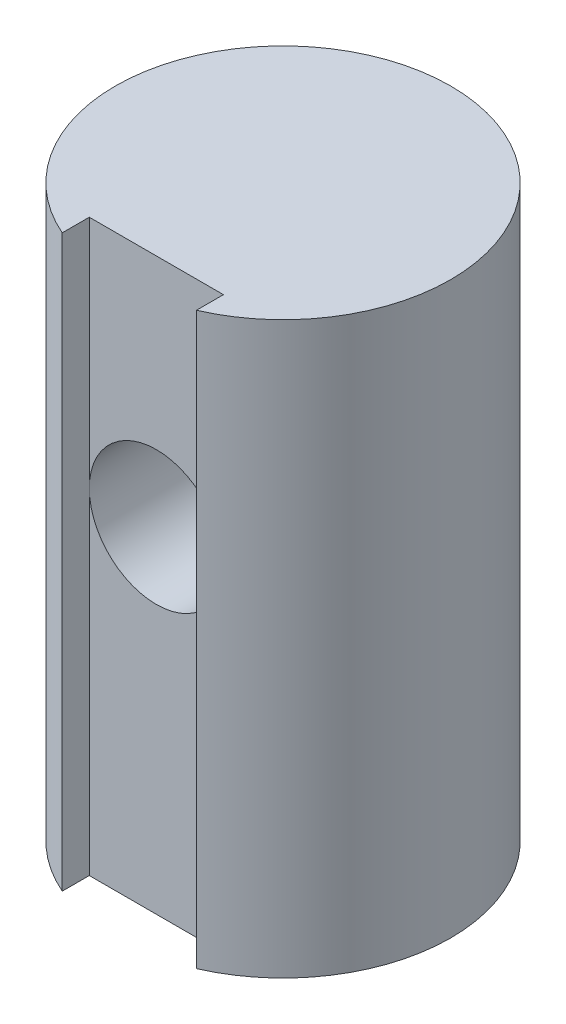
ISO-10303-21;
HEADER;
FILE_DESCRIPTION(('STEP AP214'),'2;1');
FILE_NAME('part.step','',(''),(''),'','','');
FILE_SCHEMA(('AUTOMOTIVE_DESIGN { 1 0 10303 214 1 1 1 1 }'));
ENDSEC;
DATA;
#1=APPLICATION_CONTEXT('core data for automotive mechanical design processes');
#2=APPLICATION_PROTOCOL_DEFINITION('international standard','automotive_design',2000,#1);
#3=PRODUCT_CONTEXT('',#1,'mechanical');
#4=PRODUCT('Part','Part','',(#3));
#5=PRODUCT_RELATED_PRODUCT_CATEGORY('part','',(#4));
#6=PRODUCT_DEFINITION_FORMATION('','',#4);
#7=PRODUCT_DEFINITION_CONTEXT('part definition',#1,'design');
#8=PRODUCT_DEFINITION('design','',#6,#7);
#9=PRODUCT_DEFINITION_SHAPE('','',#8);
#10=(LENGTH_UNIT() NAMED_UNIT(*) SI_UNIT(.MILLI.,.METRE.));
#11=(NAMED_UNIT(*) PLANE_ANGLE_UNIT() SI_UNIT($,.RADIAN.));
#12=(NAMED_UNIT(*) SI_UNIT($,.STERADIAN.) SOLID_ANGLE_UNIT());
#13=UNCERTAINTY_MEASURE_WITH_UNIT(LENGTH_MEASURE(1.E-05),#10,'distance_accuracy_value','');
#14=(GEOMETRIC_REPRESENTATION_CONTEXT(3) GLOBAL_UNCERTAINTY_ASSIGNED_CONTEXT((#13)) GLOBAL_UNIT_ASSIGNED_CONTEXT((#10,
#11,#12)) REPRESENTATION_CONTEXT('',''));
#15=CARTESIAN_POINT('',(0.,0.,0.));
#16=DIRECTION('',(0.,0.,1.));
#17=DIRECTION('',(1.,0.,0.));
#18=AXIS2_PLACEMENT_3D('',#15,#16,#17);
#19=CARTESIAN_POINT('',(-6.35,-22.225,11.9888));
#20=DIRECTION('',(0.,0.,-1.));
#21=DIRECTION('',(-1.,0.,0.));
#22=AXIS2_PLACEMENT_3D('',#19,#20,#21);
#23=PLANE('',#22);
#24=DIRECTION('',(0.,1.,0.));
#25=VECTOR('',#24,1.);
#26=CARTESIAN_POINT('',(-6.35,-22.225,11.9888));
#27=LINE('',#26,#25);
#28=CARTESIAN_POINT('',(-6.34999999999999,31.75,11.9888));
#29=VERTEX_POINT('',#28);
#30=CARTESIAN_POINT('',(-6.35,53.975,11.9888));
#31=VERTEX_POINT('',#30);
#32=EDGE_CURVE('E95',#29,#31,#27,.T.);
#33=ORIENTED_EDGE('',*,*,#32,.F.);
#34=CARTESIAN_POINT('',(0.,31.75,11.9888));
#35=DIRECTION('',(0.,0.,-1.));
#36=DIRECTION('',(-1.,0.,0.));
#37=AXIS2_PLACEMENT_3D('',#34,#35,#36);
#38=CIRCLE('',#37,6.35);
#39=CARTESIAN_POINT('',(6.35,31.75,11.9888));
#40=VERTEX_POINT('',#39);
#41=EDGE_CURVE('E11',#29,#40,#38,.T.);
#42=ORIENTED_EDGE('',*,*,#41,.T.);
#43=DIRECTION('',(0.,1.,0.));
#44=VECTOR('',#43,1.);
#45=CARTESIAN_POINT('',(6.35,-22.225,11.9888));
#46=LINE('',#45,#44);
#47=CARTESIAN_POINT('',(6.35,53.975,11.9888));
#48=VERTEX_POINT('',#47);
#49=EDGE_CURVE('E89',#40,#48,#46,.T.);
#50=ORIENTED_EDGE('',*,*,#49,.T.);
#51=DIRECTION('',(-1.,0.,0.));
#52=VECTOR('',#51,1.);
#53=CARTESIAN_POINT('',(-6.35,53.975,11.9888));
#54=LINE('',#53,#52);
#55=EDGE_CURVE('E132',#48,#31,#54,.T.);
#56=ORIENTED_EDGE('',*,*,#55,.T.);
#57=EDGE_LOOP('',(#33,#42,#50,#56));
#58=FACE_BOUND('',#57,.T.);
#59=ADVANCED_FACE('F39',(#58),#23,.F.);
#60=CARTESIAN_POINT('',(0.,53.975,0.));
#61=DIRECTION('',(0.,-1.,0.));
#62=DIRECTION('',(0.,0.,-1.));
#63=AXIS2_PLACEMENT_3D('',#60,#61,#62);
#64=CYLINDRICAL_SURFACE('',#63,15.875);
#65=CARTESIAN_POINT('',(0.,25.4,-15.875));
#66=CARTESIAN_POINT('',(0.170723607101093,25.4000009775439,-15.8749992379357));
#67=CARTESIAN_POINT('',(0.341513072119474,25.4068945110229,-15.8722383260364));
#68=CARTESIAN_POINT('',(0.68188376788147,25.4344065455583,-15.8612638277614));
#69=CARTESIAN_POINT('',(0.851464115148915,25.4550342133954,-15.853046599604));
#70=CARTESIAN_POINT('',(1.18845576078608,25.5098659858383,-15.8313537744373));
#71=CARTESIAN_POINT('',(1.35586160996959,25.5440991930219,-15.8178669065926));
#72=CARTESIAN_POINT('',(1.68699508198133,25.6258147099291,-15.7859860731003));
#73=CARTESIAN_POINT('',(1.85072117212244,25.6733024338095,-15.7675901023353));
#74=CARTESIAN_POINT('',(2.17272777083705,25.7808742650902,-15.7264467769563));
#75=CARTESIAN_POINT('',(2.33102622962313,25.8409109843008,-15.7037158198671));
#76=CARTESIAN_POINT('',(2.64188036497787,25.9731915315835,-15.6544202856246));
#77=CARTESIAN_POINT('',(2.79443387038562,26.0454399192444,-15.6278542770837));
#78=CARTESIAN_POINT('',(3.09274308140702,26.2015094913571,-15.5715631465376));
#79=CARTESIAN_POINT('',(3.23850394090023,26.2853217040748,-15.5418404776882));
#80=CARTESIAN_POINT('',(3.52257915148065,26.4639687639505,-15.4799301914415));
#81=CARTESIAN_POINT('',(3.66089078078056,26.5588076005522,-15.4477416833469));
#82=CARTESIAN_POINT('',(4.07494983951357,26.8674839755061,-15.345788760516));
#83=CARTESIAN_POINT('',(4.33717782605056,27.0988879918241,-15.2731105916054));
#84=CARTESIAN_POINT('',(4.82027556357494,27.6016206896703,-15.1276056440528));
#85=CARTESIAN_POINT('',(5.04112508053908,27.8729687886015,-15.0547788102182));
#86=CARTESIAN_POINT('',(5.34165986169953,28.3116065523282,-14.9497242617908));
#87=CARTESIAN_POINT('',(5.43842052775526,28.4667696506288,-14.9147052521171));
#88=CARTESIAN_POINT('',(5.61843710064922,28.7853587585731,-14.8478282319793));
#89=CARTESIAN_POINT('',(5.70169856131462,28.9487813336272,-14.81596892366));
#90=CARTESIAN_POINT('',(5.85401285078309,29.2828665745395,-14.7564512316061));
#91=CARTESIAN_POINT('',(5.92306471857994,29.4535297291431,-14.7287931320358));
#92=CARTESIAN_POINT('',(6.04624662742648,29.8008153249024,-14.6786563647696));
#93=CARTESIAN_POINT('',(6.10038414317235,29.9774347309352,-14.656175103504));
#94=CARTESIAN_POINT('',(6.19109128125189,30.3273030540485,-14.6180821344921));
#95=CARTESIAN_POINT('',(6.22834071568416,30.5003470867501,-14.6022072468936));
#96=CARTESIAN_POINT('',(6.28828888894986,30.8493079756058,-14.5764918904644));
#97=CARTESIAN_POINT('',(6.31099419911508,31.025223497467,-14.5666486964789));
#98=CARTESIAN_POINT('',(6.34160512220969,31.3785418492038,-14.5533483916629));
#99=CARTESIAN_POINT('',(6.34951386160877,31.5559443569245,-14.54988993176));
#100=CARTESIAN_POINT('',(6.35044257555404,31.9107916307016,-14.5494847436825));
#101=CARTESIAN_POINT('',(6.34346324452168,32.088236394401,-14.5525377117967));
#102=CARTESIAN_POINT('',(6.31571187824492,32.4293282151924,-14.5646013590056));
#103=CARTESIAN_POINT('',(6.29593775393472,32.5930729587772,-14.5731808070368));
#104=CARTESIAN_POINT('',(6.24378530101208,32.9182315202707,-14.5956012332201));
#105=CARTESIAN_POINT('',(6.21140282408825,33.0796445528705,-14.6094439430184));
#106=CARTESIAN_POINT('',(6.13436035715587,33.3989677872944,-14.641959980119));
#107=CARTESIAN_POINT('',(6.08970332307222,33.5568788225781,-14.6606321443417));
#108=CARTESIAN_POINT('',(5.9884923297172,33.8683205071932,-14.7022643370172));
#109=CARTESIAN_POINT('',(5.93193379827608,34.0218494472492,-14.7252260129798));
#110=CARTESIAN_POINT('',(5.80614447681109,34.326606915998,-14.775282797729));
#111=CARTESIAN_POINT('',(5.73668280778727,34.4777279784641,-14.8024514081795));
#112=CARTESIAN_POINT('',(5.58637380811055,34.7736534971388,-14.8598291662181));
#113=CARTESIAN_POINT('',(5.5055226220591,34.9184557925891,-14.8900393423967));
#114=CARTESIAN_POINT('',(5.33298475743926,35.2009669756883,-14.9527027867207));
#115=CARTESIAN_POINT('',(5.24129662782034,35.3386749098601,-14.9851563550109));
#116=CARTESIAN_POINT('',(5.04764379346816,35.6063035996781,-15.051491344233));
#117=CARTESIAN_POINT('',(4.94567855835441,35.7362239528708,-15.0853728388048));
#118=CARTESIAN_POINT('',(4.72374065123248,35.9973958731327,-15.1564013675384));
#119=CARTESIAN_POINT('',(4.60298473133204,36.127969417402,-15.1935978896649));
#120=CARTESIAN_POINT('',(4.35094499938087,36.3785361413191,-15.2676831467771));
#121=CARTESIAN_POINT('',(4.21966430279858,36.4985324300498,-15.3045719693022));
#122=CARTESIAN_POINT('',(3.94721120347967,36.7273168631247,-15.3770942903877));
#123=CARTESIAN_POINT('',(3.80603314685609,36.8360985119756,-15.4127270536668));
#124=CARTESIAN_POINT('',(3.51472105889454,37.0415966976841,-15.4817555907358));
#125=CARTESIAN_POINT('',(3.3645906402165,37.138318053327,-15.515152255491));
#126=CARTESIAN_POINT('',(3.0530838443351,37.320854689203,-15.5794769293948));
#127=CARTESIAN_POINT('',(2.89154120251666,37.4064091816201,-15.6103411818834));
#128=CARTESIAN_POINT('',(2.56113556699778,37.5634781785282,-15.6679390786474));
#129=CARTESIAN_POINT('',(2.39227555161075,37.6349983309442,-15.6946743836339));
#130=CARTESIAN_POINT('',(2.04840609874292,37.7633354385059,-15.7432461349893));
#131=CARTESIAN_POINT('',(1.87339788816642,37.8201553084516,-15.7650835524063));
#132=CARTESIAN_POINT('',(1.51854727505531,37.9185009907744,-15.8032107951068));
#133=CARTESIAN_POINT('',(1.33870520815153,37.9600278620672,-15.8195010044836));
#134=CARTESIAN_POINT('',(0.986412879014924,38.025321349207,-15.8452497634842));
#135=CARTESIAN_POINT('',(0.814155502955502,38.0499940195391,-15.8550557263235));
#136=CARTESIAN_POINT('',(0.467973143281642,38.0851215768813,-15.8690462489131));
#137=CARTESIAN_POINT('',(0.294048242238786,38.0955771642606,-15.8732310855741));
#138=CARTESIAN_POINT('',(-0.0540764955769258,38.1021554507279,-15.8758620284321));
#139=CARTESIAN_POINT('',(-0.228276263225354,38.0982813115358,-15.8743094005471));
#140=CARTESIAN_POINT('',(-0.575622864622698,38.0762500877826,-15.8655117424955));
#141=CARTESIAN_POINT('',(-0.748769718495297,38.0580932770672,-15.858266821469));
#142=CARTESIAN_POINT('',(-1.08489756413692,38.0088365612771,-15.8387397264841));
#143=CARTESIAN_POINT('',(-1.24798436110302,37.9783586350984,-15.8266999817964));
#144=CARTESIAN_POINT('',(-1.57093270860248,37.9048439618445,-15.7979139535108));
#145=CARTESIAN_POINT('',(-1.73079318547845,37.8618031054116,-15.7811661299578));
#146=CARTESIAN_POINT('',(-2.04615946130208,37.7635681757866,-15.7433819035244));
#147=CARTESIAN_POINT('',(-2.20166645555248,37.7083774761141,-15.7223466911983));
#148=CARTESIAN_POINT('',(-2.50749236746306,37.5862748369083,-15.6764800892104));
#149=CARTESIAN_POINT('',(-2.65780928540707,37.5193584385257,-15.6516472559128));
#150=CARTESIAN_POINT('',(-2.9567997741866,37.3721379384355,-15.5979717110152));
#151=CARTESIAN_POINT('',(-3.10528655007771,37.2914904967998,-15.5690305330525));
#152=CARTESIAN_POINT('',(-3.39500995336589,37.1188782124767,-15.5084314832285));
#153=CARTESIAN_POINT('',(-3.53624407271717,37.0269094916254,-15.4767726815611));
#154=CARTESIAN_POINT('',(-3.81068759574832,36.8322697741589,-15.4114952378658));
#155=CARTESIAN_POINT('',(-3.94389564005318,36.7295969725906,-15.3778762657309));
#156=CARTESIAN_POINT('',(-4.20158482480528,36.5141778604435,-15.3094769599519));
#157=CARTESIAN_POINT('',(-4.3260655846793,36.4014311110542,-15.2746965757592));
#158=CARTESIAN_POINT('',(-4.57360830422331,36.1586973662621,-15.2024813294817));
#159=CARTESIAN_POINT('',(-4.69602961543892,36.0280630186992,-15.1650232941493));
#160=CARTESIAN_POINT('',(-4.92945473983622,35.7568661257529,-15.090762118334));
#161=CARTESIAN_POINT('',(-5.04046209778611,35.6163066857639,-15.0539587774806));
#162=CARTESIAN_POINT('',(-5.25045310181207,35.325941923647,-14.9820123969902));
#163=CARTESIAN_POINT('',(-5.34942984067774,35.1761313638524,-14.946870318152));
#164=CARTESIAN_POINT('',(-5.53453989453151,34.8682710389516,-14.8793212389896));
#165=CARTESIAN_POINT('',(-5.62067860719687,34.7102247744391,-14.8469130917003));
#166=CARTESIAN_POINT('',(-5.78028102521634,34.3851414141103,-14.7855120591914));
#167=CARTESIAN_POINT('',(-5.85360625025088,34.2180289617495,-14.7565574473069));
#168=CARTESIAN_POINT('',(-5.98577798770023,33.8775102748479,-14.7034405307806));
#169=CARTESIAN_POINT('',(-6.04463069642992,33.7041067703995,-14.679276176083));
#170=CARTESIAN_POINT('',(-6.14725596164674,33.3522818084116,-14.6365966526919));
#171=CARTESIAN_POINT('',(-6.19103449456683,33.173862369948,-14.6180792454965));
#172=CARTESIAN_POINT('',(-6.26302669721775,32.8133770299878,-14.5873801728499));
#173=CARTESIAN_POINT('',(-6.29124166997897,32.6313114350819,-14.5751979769997));
#174=CARTESIAN_POINT('',(-6.33029550755702,32.2782893730162,-14.5582759420259));
#175=CARTESIAN_POINT('',(-6.34223928841943,32.1074769932551,-14.5530633618454));
#176=CARTESIAN_POINT('',(-6.35228648895448,31.7653705465324,-14.5486808351446));
#177=CARTESIAN_POINT('',(-6.35039049805518,31.5940765003953,-14.5495106312829));
#178=CARTESIAN_POINT('',(-6.33278160039904,31.2523597912103,-14.5571835389839));
#179=CARTESIAN_POINT('',(-6.31707036953983,31.0819370249914,-14.5640259211725));
#180=CARTESIAN_POINT('',(-6.27201114492921,30.7432416048133,-14.5834872939595));
#181=CARTESIAN_POINT('',(-6.24266321390579,30.5749689409674,-14.5961062579861));
#182=CARTESIAN_POINT('',(-6.172082692541,30.2484418382015,-14.6260871404982));
#183=CARTESIAN_POINT('',(-6.13136993734204,30.0900553047569,-14.6432401640875));
#184=CARTESIAN_POINT('',(-6.03802553073147,29.7773404026148,-14.6819761854047));
#185=CARTESIAN_POINT('',(-5.98538999549603,29.623013374618,-14.7035606264437));
#186=CARTESIAN_POINT('',(-5.86864882245775,29.3193815848358,-14.7505437350288));
#187=CARTESIAN_POINT('',(-5.80454470353523,29.1700761611043,-14.7759418974204));
#188=CARTESIAN_POINT('',(-5.66534290394944,28.8772475882977,-14.8298713538933));
#189=CARTESIAN_POINT('',(-5.5902412299486,28.733726563847,-14.8584037851191));
#190=CARTESIAN_POINT('',(-5.34003416149758,28.2970134954058,-14.9510024576274));
#191=CARTESIAN_POINT('',(-5.14662610364775,28.0149457241491,-15.0192861294896));
#192=CARTESIAN_POINT('',(-4.71764629570959,27.4859211934272,-15.1594916775686));
#193=CARTESIAN_POINT('',(-4.48206183715388,27.2389750570643,-15.2314146456685));
#194=CARTESIAN_POINT('',(-4.09285023991574,26.8916032374013,-15.3389694998403));
#195=CARTESIAN_POINT('',(-3.9523280076533,26.7766091014711,-15.3758635797582));
#196=CARTESIAN_POINT('',(-3.66164523197759,26.5588736188311,-15.4476649582441));
#197=CARTESIAN_POINT('',(-3.51148825306599,26.4561277804501,-15.4825729826643));
#198=CARTESIAN_POINT('',(-3.20228984057822,26.2635575788072,-15.5494698726427));
#199=CARTESIAN_POINT('',(-3.04324019072442,26.1737454488119,-15.5814559641902));
#200=CARTESIAN_POINT('',(-2.71747396731055,26.0079431752459,-15.6415591433313));
#201=CARTESIAN_POINT('',(-2.55076094138471,25.9319467150848,-15.6696779976052));
#202=CARTESIAN_POINT('',(-2.21384500569459,25.7956898355515,-15.7207829722343));
#203=CARTESIAN_POINT('',(-2.04376017151406,25.735169093481,-15.7438529090353));
#204=CARTESIAN_POINT('',(-1.69855327296541,25.6287240308898,-15.7848259421193));
#205=CARTESIAN_POINT('',(-1.52343361694723,25.5827928542439,-15.8027314649683));
#206=CARTESIAN_POINT('',(-1.16989732365691,25.5060843674199,-15.8328255652754));
#207=CARTESIAN_POINT('',(-0.991490150826793,25.4752690042698,-15.8450284948938));
#208=CARTESIAN_POINT('',(-0.632479267780928,25.4289887240137,-15.8634123905131));
#209=CARTESIAN_POINT('',(-0.451877325735067,25.413512184706,-15.8695979158258));
#210=CARTESIAN_POINT('',(-0.22583819734172,25.4038561507717,-15.8734579498475));
#211=CARTESIAN_POINT('',(-0.180685888003587,25.4024104163018,-15.8740359668143));
#212=CARTESIAN_POINT('',(-0.0903572565847043,25.4004822117897,-15.8748070926387));
#213=CARTESIAN_POINT('',(-0.0451809345151426,25.3999997412991,-15.8750002016756));
#214=CARTESIAN_POINT('',(0.,25.4,-15.875));
#215=B_SPLINE_CURVE_WITH_KNOTS('',3,(#65,#66,#67,#68,#69,#70,#71,#72,#73,#74,#75,#76,#77,#78,
#79,#80,#81,#82,#83,#84,#85,#86,#87,#88,#89,#90,#91,#92,#93,#94,#95,#96,#97,#98,#99,#100,#101,
#102,#103,#104,#105,#106,#107,#108,#109,#110,#111,#112,#113,#114,#115,#116,#117,#118,#119,#120,
#121,#122,#123,#124,#125,#126,#127,#128,#129,#130,#131,#132,#133,#134,#135,#136,#137,#138,#139,
#140,#141,#142,#143,#144,#145,#146,#147,#148,#149,#150,#151,#152,#153,#154,#155,#156,#157,#158,
#159,#160,#161,#162,#163,#164,#165,#166,#167,#168,#169,#170,#171,#172,#173,#174,#175,#176,#177,
#178,#179,#180,#181,#182,#183,#184,#185,#186,#187,#188,#189,#190,#191,#192,#193,#194,#195,#196,
#197,#198,#199,#200,#201,#202,#203,#204,#205,#206,#207,#208,#209,#210,#211,#212,#213,#214),
.UNSPECIFIED.,.T.,.F.,(4,2,2,2,2,2,2,2,2,2,2,2,2,2,2,2,2,2,2,2,2,2,2,2,2,2,2,2,2,2,2,2,2,2,2,2,
2,2,2,2,2,2,2,2,2,2,2,2,2,2,2,2,2,2,2,2,2,2,2,2,2,2,2,2,2,2,2,2,2,2,2,2,2,2,4),(0.,
0.512124382311235,1.02459092264965,1.53815959243259,2.05193835066657,2.56381091110559,
3.07587501827014,3.58754405403078,4.09939879164054,5.16602823484464,6.2331779050246,
6.79113951652755,7.34887098638722,7.90664016368849,8.46412929052212,8.99658033452874,
9.52879063629667,10.0608884709664,10.5929614876403,11.0878534150597,11.582908306114,
12.0778440837123,12.5729703478685,13.0780018599333,13.5832047398929,14.0884753425602,
14.5937720345786,15.1382522593458,15.6825719019263,16.2272050625612,16.771619908622,
17.3270693637361,17.8822948254351,18.4374101114507,18.9924869530174,19.5146952887895,
20.0368778983341,20.5589453000502,21.0810026922584,21.5794682470751,22.0780970339697,
22.5765875460674,23.0752680286512,23.589011955189,24.1029323597176,24.6169395635889,
25.1309691679982,25.6790618160507,26.2269837285863,26.7752187515604,27.323222617917,
27.8768249842319,28.4301899149621,28.9833352007382,29.5364341684134,30.0497057439602,
30.562955459688,31.0761429227633,31.5893280252306,32.082076185268,32.5749850885387,
33.0678287600271,33.5608518344752,34.6023735084612,35.6442095404728,36.1995036499712,
36.7545934925732,37.3102049627557,37.8655617623169,38.4108495974275,38.95588080312,
39.4995327989478,40.0427725549058,40.178303131755,40.3138336455117),.UNSPECIFIED.);
#216=CARTESIAN_POINT('',(0.,25.4,-15.875));
#217=VERTEX_POINT('',#216);
#218=EDGE_CURVE('E134',#217,#217,#215,.T.);
#219=ORIENTED_EDGE('',*,*,#218,.T.);
#220=EDGE_LOOP('',(#219));
#221=FACE_BOUND('',#220,.T.);
#222=CARTESIAN_POINT('',(0.,53.975,0.));
#223=DIRECTION('',(0.,1.,0.));
#224=DIRECTION('',(0.,0.,1.));
#225=AXIS2_PLACEMENT_3D('',#222,#223,#224);
#226=CIRCLE('',#225,15.875);
#227=CARTESIAN_POINT('',(6.35,53.975,14.5496778314848));
#228=VERTEX_POINT('',#227);
#229=CARTESIAN_POINT('',(-6.35,53.975,14.5496778314848));
#230=VERTEX_POINT('',#229);
#231=EDGE_CURVE('E113',#228,#230,#226,.T.);
#232=ORIENTED_EDGE('',*,*,#231,.F.);
#233=DIRECTION('',(0.,-1.,0.));
#234=VECTOR('',#233,1.);
#235=CARTESIAN_POINT('',(6.35,53.975,14.5496778314848));
#236=LINE('',#235,#234);
#237=CARTESIAN_POINT('',(6.35,0.,14.5496778314848));
#238=VERTEX_POINT('',#237);
#239=EDGE_CURVE('E115',#228,#238,#236,.T.);
#240=ORIENTED_EDGE('',*,*,#239,.T.);
#241=CARTESIAN_POINT('',(0.,0.,0.));
#242=DIRECTION('',(0.,1.,0.));
#243=DIRECTION('',(0.,0.,1.));
#244=AXIS2_PLACEMENT_3D('',#241,#242,#243);
#245=CIRCLE('',#244,15.875);
#246=CARTESIAN_POINT('',(-6.35,0.,14.5496778314848));
#247=VERTEX_POINT('',#246);
#248=EDGE_CURVE('E111',#238,#247,#245,.T.);
#249=ORIENTED_EDGE('',*,*,#248,.T.);
#250=DIRECTION('',(0.,-1.,0.));
#251=VECTOR('',#250,1.);
#252=CARTESIAN_POINT('',(-6.35,53.975,14.5496778314848));
#253=LINE('',#252,#251);
#254=EDGE_CURVE('E109',#247,#230,#253,.F.);
#255=ORIENTED_EDGE('',*,*,#254,.T.);
#256=EDGE_LOOP('',(#232,#240,#249,#255));
#257=FACE_BOUND('',#256,.T.);
#258=ADVANCED_FACE('F41',(#221,#257),#64,.T.);
#259=CARTESIAN_POINT('',(0.,53.975,0.));
#260=DIRECTION('',(0.,1.,0.));
#261=DIRECTION('',(0.,0.,1.));
#262=AXIS2_PLACEMENT_3D('',#259,#260,#261);
#263=PLANE('',#262);
#264=DIRECTION('',(0.,0.,-1.));
#265=VECTOR('',#264,1.);
#266=CARTESIAN_POINT('',(6.35,53.975,11.9888));
#267=LINE('',#266,#265);
#268=EDGE_CURVE('E99',#228,#48,#267,.T.);
#269=ORIENTED_EDGE('',*,*,#268,.F.);
#270=ORIENTED_EDGE('',*,*,#231,.T.);
#271=DIRECTION('',(0.,0.,1.));
#272=VECTOR('',#271,1.);
#273=CARTESIAN_POINT('',(-6.35,53.975,11.9888));
#274=LINE('',#273,#272);
#275=EDGE_CURVE('E105',#31,#230,#274,.T.);
#276=ORIENTED_EDGE('',*,*,#275,.F.);
#277=ORIENTED_EDGE('',*,*,#55,.F.);
#278=EDGE_LOOP('',(#269,#270,#276,#277));
#279=FACE_BOUND('',#278,.T.);
#280=ADVANCED_FACE('F129',(#279),#263,.T.);
#281=CARTESIAN_POINT('',(0.,0.,0.));
#282=DIRECTION('',(0.,1.,0.));
#283=DIRECTION('',(0.,0.,1.));
#284=AXIS2_PLACEMENT_3D('',#281,#282,#283);
#285=PLANE('',#284);
#286=ORIENTED_EDGE('',*,*,#248,.F.);
#287=DIRECTION('',(0.,0.,-1.));
#288=VECTOR('',#287,1.);
#289=CARTESIAN_POINT('',(6.35,0.,0.));
#290=LINE('',#289,#288);
#291=CARTESIAN_POINT('',(6.35,0.,11.9888));
#292=VERTEX_POINT('',#291);
#293=EDGE_CURVE('E88',#238,#292,#290,.T.);
#294=ORIENTED_EDGE('',*,*,#293,.T.);
#295=DIRECTION('',(-1.,0.,0.));
#296=VECTOR('',#295,1.);
#297=CARTESIAN_POINT('',(0.,0.,11.9888));
#298=LINE('',#297,#296);
#299=CARTESIAN_POINT('',(-6.35,0.,11.9888));
#300=VERTEX_POINT('',#299);
#301=EDGE_CURVE('E106',#292,#300,#298,.T.);
#302=ORIENTED_EDGE('',*,*,#301,.T.);
#303=DIRECTION('',(0.,0.,1.));
#304=VECTOR('',#303,1.);
#305=CARTESIAN_POINT('',(-6.35,0.,0.));
#306=LINE('',#305,#304);
#307=EDGE_CURVE('E122',#300,#247,#306,.T.);
#308=ORIENTED_EDGE('',*,*,#307,.T.);
#309=EDGE_LOOP('',(#286,#294,#302,#308));
#310=FACE_BOUND('',#309,.T.);
#311=ADVANCED_FACE('F123',(#310),#285,.F.);
#312=CARTESIAN_POINT('',(6.35,-22.225,11.9888));
#313=DIRECTION('',(1.,0.,0.));
#314=DIRECTION('',(0.,0.,-1.));
#315=AXIS2_PLACEMENT_3D('',#312,#313,#314);
#316=PLANE('',#315);
#317=ORIENTED_EDGE('',*,*,#49,.F.);
#318=EDGE_CURVE('E100',#292,#40,#46,.T.);
#319=ORIENTED_EDGE('',*,*,#318,.F.);
#320=ORIENTED_EDGE('',*,*,#293,.F.);
#321=ORIENTED_EDGE('',*,*,#239,.F.);
#322=ORIENTED_EDGE('',*,*,#268,.T.);
#323=EDGE_LOOP('',(#317,#319,#320,#321,#322));
#324=FACE_BOUND('',#323,.T.);
#325=ADVANCED_FACE('F92',(#324),#316,.F.);
#326=CARTESIAN_POINT('',(-6.35,-22.225,11.9888));
#327=DIRECTION('',(-1.,0.,0.));
#328=DIRECTION('',(0.,0.,1.));
#329=AXIS2_PLACEMENT_3D('',#326,#327,#328);
#330=PLANE('',#329);
#331=EDGE_CURVE('E56',#300,#29,#27,.T.);
#332=ORIENTED_EDGE('',*,*,#331,.T.);
#333=ORIENTED_EDGE('',*,*,#32,.T.);
#334=ORIENTED_EDGE('',*,*,#275,.T.);
#335=ORIENTED_EDGE('',*,*,#254,.F.);
#336=ORIENTED_EDGE('',*,*,#307,.F.);
#337=EDGE_LOOP('',(#332,#333,#334,#335,#336));
#338=FACE_BOUND('',#337,.T.);
#339=ADVANCED_FACE('F137',(#338),#330,.F.);
#340=ORIENTED_EDGE('',*,*,#318,.T.);
#341=EDGE_CURVE('E42',#40,#29,#38,.T.);
#342=ORIENTED_EDGE('',*,*,#341,.T.);
#343=ORIENTED_EDGE('',*,*,#331,.F.);
#344=ORIENTED_EDGE('',*,*,#301,.F.);
#345=EDGE_LOOP('',(#340,#342,#343,#344));
#346=FACE_BOUND('',#345,.T.);
#347=ADVANCED_FACE('F102',(#346),#23,.F.);
#348=CARTESIAN_POINT('',(0.,31.75,-15.875));
#349=DIRECTION('',(0.,0.,1.));
#350=DIRECTION('',(1.,0.,0.));
#351=AXIS2_PLACEMENT_3D('',#348,#349,#350);
#352=CYLINDRICAL_SURFACE('',#351,6.35);
#353=ORIENTED_EDGE('',*,*,#341,.F.);
#354=ORIENTED_EDGE('',*,*,#41,.F.);
#355=EDGE_LOOP('',(#353,#354));
#356=FACE_BOUND('',#355,.T.);
#357=ORIENTED_EDGE('',*,*,#218,.F.);
#358=EDGE_LOOP('',(#357));
#359=FACE_BOUND('',#358,.T.);
#360=ADVANCED_FACE('F84',(#356,#359),#352,.F.);
#361=CLOSED_SHELL('',(#59,#258,#280,#311,#325,#339,#347,#360));
#362=MANIFOLD_SOLID_BREP('B2',#361);
#363=ADVANCED_BREP_SHAPE_REPRESENTATION('',(#18,#362),#14);
#364=SHAPE_DEFINITION_REPRESENTATION(#9,#363);
ENDSEC;
END-ISO-10303-21;
